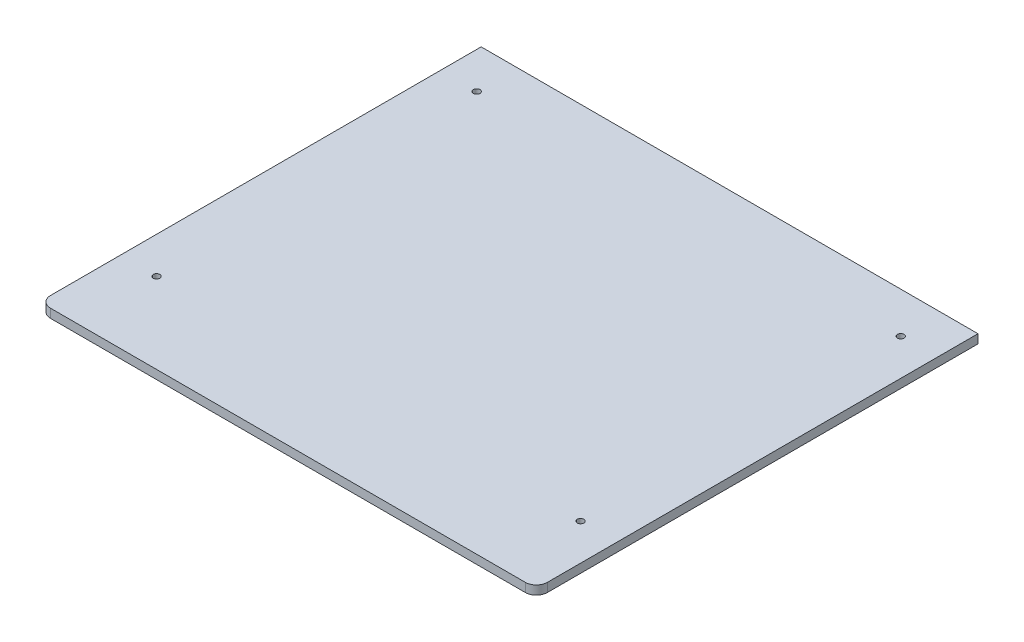
ISO-10303-21;
HEADER;
FILE_DESCRIPTION(('STEP AP214'),'2;1');
FILE_NAME('part.step','',(''),(''),'','','');
FILE_SCHEMA(('AUTOMOTIVE_DESIGN { 1 0 10303 214 1 1 1 1 }'));
ENDSEC;
DATA;
#1=APPLICATION_CONTEXT('core data for automotive mechanical design processes');
#2=APPLICATION_PROTOCOL_DEFINITION('international standard','automotive_design',2000,#1);
#3=PRODUCT_CONTEXT('',#1,'mechanical');
#4=PRODUCT('Part','Part','',(#3));
#5=PRODUCT_RELATED_PRODUCT_CATEGORY('part','',(#4));
#6=PRODUCT_DEFINITION_FORMATION('','',#4);
#7=PRODUCT_DEFINITION_CONTEXT('part definition',#1,'design');
#8=PRODUCT_DEFINITION('design','',#6,#7);
#9=PRODUCT_DEFINITION_SHAPE('','',#8);
#10=(LENGTH_UNIT() NAMED_UNIT(*) SI_UNIT(.MILLI.,.METRE.));
#11=(NAMED_UNIT(*) PLANE_ANGLE_UNIT() SI_UNIT($,.RADIAN.));
#12=(NAMED_UNIT(*) SI_UNIT($,.STERADIAN.) SOLID_ANGLE_UNIT());
#13=UNCERTAINTY_MEASURE_WITH_UNIT(LENGTH_MEASURE(1.E-05),#10,'distance_accuracy_value','');
#14=(GEOMETRIC_REPRESENTATION_CONTEXT(3) GLOBAL_UNCERTAINTY_ASSIGNED_CONTEXT((#13)) GLOBAL_UNIT_ASSIGNED_CONTEXT((#10,
#11,#12)) REPRESENTATION_CONTEXT('',''));
#15=CARTESIAN_POINT('',(0.,0.,0.));
#16=DIRECTION('',(0.,0.,1.));
#17=DIRECTION('',(1.,0.,0.));
#18=AXIS2_PLACEMENT_3D('',#15,#16,#17);
#19=CARTESIAN_POINT('',(0.,8.,0.));
#20=DIRECTION('',(1.,0.,0.));
#21=DIRECTION('',(0.,0.,-1.));
#22=AXIS2_PLACEMENT_3D('',#19,#20,#21);
#23=PLANE('',#22);
#24=DIRECTION('',(0.,0.,1.));
#25=VECTOR('',#24,1.);
#26=CARTESIAN_POINT('',(0.,0.,0.));
#27=LINE('',#26,#25);
#28=CARTESIAN_POINT('',(0.,0.,0.));
#29=VERTEX_POINT('',#28);
#30=CARTESIAN_POINT('',(0.,0.,390.));
#31=VERTEX_POINT('',#30);
#32=EDGE_CURVE('E116',#29,#31,#27,.T.);
#33=ORIENTED_EDGE('',*,*,#32,.T.);
#34=DIRECTION('',(0.,-1.,0.));
#35=VECTOR('',#34,1.);
#36=CARTESIAN_POINT('',(0.,8.,390.));
#37=LINE('',#36,#35);
#38=CARTESIAN_POINT('',(0.,8.,390.));
#39=VERTEX_POINT('',#38);
#40=EDGE_CURVE('E11',#31,#39,#37,.F.);
#41=ORIENTED_EDGE('',*,*,#40,.T.);
#42=DIRECTION('',(0.,0.,1.));
#43=VECTOR('',#42,1.);
#44=CARTESIAN_POINT('',(0.,8.,0.));
#45=LINE('',#44,#43);
#46=CARTESIAN_POINT('',(0.,8.,0.));
#47=VERTEX_POINT('',#46);
#48=EDGE_CURVE('E123',#47,#39,#45,.T.);
#49=ORIENTED_EDGE('',*,*,#48,.F.);
#50=DIRECTION('',(0.,-1.,0.));
#51=VECTOR('',#50,1.);
#52=CARTESIAN_POINT('',(0.,8.,0.));
#53=LINE('',#52,#51);
#54=EDGE_CURVE('E108',#47,#29,#53,.T.);
#55=ORIENTED_EDGE('',*,*,#54,.T.);
#56=EDGE_LOOP('',(#33,#41,#49,#55));
#57=FACE_BOUND('',#56,.T.);
#58=ADVANCED_FACE('F34',(#57),#23,.F.);
#59=CARTESIAN_POINT('',(0.,8.,400.));
#60=DIRECTION('',(0.,0.,-1.));
#61=DIRECTION('',(-1.,0.,0.));
#62=AXIS2_PLACEMENT_3D('',#59,#60,#61);
#63=PLANE('',#62);
#64=DIRECTION('',(1.,0.,0.));
#65=VECTOR('',#64,1.);
#66=CARTESIAN_POINT('',(0.,0.,400.));
#67=LINE('',#66,#65);
#68=CARTESIAN_POINT('',(10.,0.,400.));
#69=VERTEX_POINT('',#68);
#70=CARTESIAN_POINT('',(440.,0.,400.));
#71=VERTEX_POINT('',#70);
#72=EDGE_CURVE('E118',#69,#71,#67,.T.);
#73=ORIENTED_EDGE('',*,*,#72,.T.);
#74=DIRECTION('',(0.,-1.,0.));
#75=VECTOR('',#74,1.);
#76=CARTESIAN_POINT('',(440.,8.,400.));
#77=LINE('',#76,#75);
#78=CARTESIAN_POINT('',(440.,8.,400.));
#79=VERTEX_POINT('',#78);
#80=EDGE_CURVE('E55',#71,#79,#77,.F.);
#81=ORIENTED_EDGE('',*,*,#80,.T.);
#82=DIRECTION('',(1.,0.,0.));
#83=VECTOR('',#82,1.);
#84=CARTESIAN_POINT('',(0.,8.,400.));
#85=LINE('',#84,#83);
#86=CARTESIAN_POINT('',(10.,8.,400.));
#87=VERTEX_POINT('',#86);
#88=EDGE_CURVE('E98',#87,#79,#85,.T.);
#89=ORIENTED_EDGE('',*,*,#88,.F.);
#90=DIRECTION('',(0.,-1.,0.));
#91=VECTOR('',#90,1.);
#92=CARTESIAN_POINT('',(10.,8.,400.));
#93=LINE('',#92,#91);
#94=EDGE_CURVE('E130',#87,#69,#93,.T.);
#95=ORIENTED_EDGE('',*,*,#94,.T.);
#96=EDGE_LOOP('',(#73,#81,#89,#95));
#97=FACE_BOUND('',#96,.T.);
#98=ADVANCED_FACE('F138',(#97),#63,.F.);
#99=CARTESIAN_POINT('',(450.,8.,0.));
#100=DIRECTION('',(-1.,0.,0.));
#101=DIRECTION('',(0.,0.,1.));
#102=AXIS2_PLACEMENT_3D('',#99,#100,#101);
#103=PLANE('',#102);
#104=DIRECTION('',(0.,0.,-1.));
#105=VECTOR('',#104,1.);
#106=CARTESIAN_POINT('',(450.,8.,0.));
#107=LINE('',#106,#105);
#108=CARTESIAN_POINT('',(450.,8.,390.));
#109=VERTEX_POINT('',#108);
#110=CARTESIAN_POINT('',(450.,8.,0.));
#111=VERTEX_POINT('',#110);
#112=EDGE_CURVE('E88',#109,#111,#107,.T.);
#113=ORIENTED_EDGE('',*,*,#112,.F.);
#114=DIRECTION('',(0.,-1.,0.));
#115=VECTOR('',#114,1.);
#116=CARTESIAN_POINT('',(450.,8.,390.));
#117=LINE('',#116,#115);
#118=CARTESIAN_POINT('',(450.,0.,390.));
#119=VERTEX_POINT('',#118);
#120=EDGE_CURVE('E107',#109,#119,#117,.T.);
#121=ORIENTED_EDGE('',*,*,#120,.T.);
#122=DIRECTION('',(0.,0.,-1.));
#123=VECTOR('',#122,1.);
#124=CARTESIAN_POINT('',(450.,0.,0.));
#125=LINE('',#124,#123);
#126=CARTESIAN_POINT('',(450.,0.,0.));
#127=VERTEX_POINT('',#126);
#128=EDGE_CURVE('E104',#119,#127,#125,.T.);
#129=ORIENTED_EDGE('',*,*,#128,.T.);
#130=DIRECTION('',(0.,-1.,0.));
#131=VECTOR('',#130,1.);
#132=CARTESIAN_POINT('',(450.,8.,0.));
#133=LINE('',#132,#131);
#134=EDGE_CURVE('E101',#111,#127,#133,.T.);
#135=ORIENTED_EDGE('',*,*,#134,.F.);
#136=EDGE_LOOP('',(#113,#121,#129,#135));
#137=FACE_BOUND('',#136,.T.);
#138=ADVANCED_FACE('F102',(#137),#103,.F.);
#139=CARTESIAN_POINT('',(0.,8.,0.));
#140=DIRECTION('',(0.,0.,1.));
#141=DIRECTION('',(1.,0.,0.));
#142=AXIS2_PLACEMENT_3D('',#139,#140,#141);
#143=PLANE('',#142);
#144=DIRECTION('',(-1.,0.,0.));
#145=VECTOR('',#144,1.);
#146=CARTESIAN_POINT('',(0.,0.,0.));
#147=LINE('',#146,#145);
#148=EDGE_CURVE('E122',#127,#29,#147,.T.);
#149=ORIENTED_EDGE('',*,*,#148,.T.);
#150=ORIENTED_EDGE('',*,*,#54,.F.);
#151=DIRECTION('',(-1.,0.,0.));
#152=VECTOR('',#151,1.);
#153=CARTESIAN_POINT('',(0.,8.,0.));
#154=LINE('',#153,#152);
#155=EDGE_CURVE('E92',#111,#47,#154,.T.);
#156=ORIENTED_EDGE('',*,*,#155,.F.);
#157=ORIENTED_EDGE('',*,*,#134,.T.);
#158=EDGE_LOOP('',(#149,#150,#156,#157));
#159=FACE_BOUND('',#158,.T.);
#160=ADVANCED_FACE('F110',(#159),#143,.F.);
#161=CARTESIAN_POINT('',(0.,8.,400.));
#162=DIRECTION('',(0.,1.,0.));
#163=DIRECTION('',(0.,0.,1.));
#164=AXIS2_PLACEMENT_3D('',#161,#162,#163);
#165=PLANE('',#164);
#166=CARTESIAN_POINT('',(417.,8.,327.));
#167=DIRECTION('',(0.,1.,0.));
#168=DIRECTION('',(0.,0.,1.));
#169=AXIS2_PLACEMENT_3D('',#166,#167,#168);
#170=CIRCLE('',#169,2.99999999999999);
#171=CARTESIAN_POINT('',(417.,8.,330.));
#172=VERTEX_POINT('',#171);
#173=EDGE_CURVE('E163',#172,#172,#170,.T.);
#174=ORIENTED_EDGE('',*,*,#173,.F.);
#175=EDGE_LOOP('',(#174));
#176=FACE_BOUND('',#175,.T.);
#177=CARTESIAN_POINT('',(417.,8.,37.));
#178=DIRECTION('',(0.,1.,0.));
#179=DIRECTION('',(0.,0.,1.));
#180=AXIS2_PLACEMENT_3D('',#177,#178,#179);
#181=CIRCLE('',#180,2.99999999999999);
#182=CARTESIAN_POINT('',(417.,8.,40.));
#183=VERTEX_POINT('',#182);
#184=EDGE_CURVE('E157',#183,#183,#181,.T.);
#185=ORIENTED_EDGE('',*,*,#184,.F.);
#186=EDGE_LOOP('',(#185));
#187=FACE_BOUND('',#186,.T.);
#188=CARTESIAN_POINT('',(33.,8.,327.));
#189=DIRECTION('',(0.,1.,0.));
#190=DIRECTION('',(0.,0.,1.));
#191=AXIS2_PLACEMENT_3D('',#188,#189,#190);
#192=CIRCLE('',#191,3.);
#193=CARTESIAN_POINT('',(33.,8.,330.));
#194=VERTEX_POINT('',#193);
#195=EDGE_CURVE('E151',#194,#194,#192,.T.);
#196=ORIENTED_EDGE('',*,*,#195,.F.);
#197=EDGE_LOOP('',(#196));
#198=FACE_BOUND('',#197,.T.);
#199=CARTESIAN_POINT('',(33.,8.,37.));
#200=DIRECTION('',(0.,1.,0.));
#201=DIRECTION('',(0.,0.,1.));
#202=AXIS2_PLACEMENT_3D('',#199,#200,#201);
#203=CIRCLE('',#202,3.);
#204=CARTESIAN_POINT('',(33.,8.,40.));
#205=VERTEX_POINT('',#204);
#206=EDGE_CURVE('E145',#205,#205,#203,.T.);
#207=ORIENTED_EDGE('',*,*,#206,.F.);
#208=EDGE_LOOP('',(#207));
#209=FACE_BOUND('',#208,.T.);
#210=ORIENTED_EDGE('',*,*,#88,.T.);
#211=CARTESIAN_POINT('',(440.,8.,390.));
#212=DIRECTION('',(0.,1.,0.));
#213=DIRECTION('',(0.,0.,1.));
#214=AXIS2_PLACEMENT_3D('',#211,#212,#213);
#215=CIRCLE('',#214,10.);
#216=EDGE_CURVE('E42',#79,#109,#215,.T.);
#217=ORIENTED_EDGE('',*,*,#216,.T.);
#218=ORIENTED_EDGE('',*,*,#112,.T.);
#219=ORIENTED_EDGE('',*,*,#155,.T.);
#220=ORIENTED_EDGE('',*,*,#48,.T.);
#221=CARTESIAN_POINT('',(10.,8.,390.));
#222=DIRECTION('',(0.,1.,0.));
#223=DIRECTION('',(0.,0.,1.));
#224=AXIS2_PLACEMENT_3D('',#221,#222,#223);
#225=CIRCLE('',#224,10.);
#226=EDGE_CURVE('E134',#39,#87,#225,.T.);
#227=ORIENTED_EDGE('',*,*,#226,.T.);
#228=EDGE_LOOP('',(#210,#217,#218,#219,#220,#227));
#229=FACE_BOUND('',#228,.T.);
#230=ADVANCED_FACE('F90',(#176,#187,#198,#209,#229),#165,.T.);
#231=CARTESIAN_POINT('',(0.,0.,400.));
#232=DIRECTION('',(0.,1.,0.));
#233=DIRECTION('',(0.,0.,1.));
#234=AXIS2_PLACEMENT_3D('',#231,#232,#233);
#235=PLANE('',#234);
#236=CARTESIAN_POINT('',(417.,0.,327.));
#237=DIRECTION('',(0.,1.,0.));
#238=DIRECTION('',(0.,0.,1.));
#239=AXIS2_PLACEMENT_3D('',#236,#237,#238);
#240=CIRCLE('',#239,2.99999999999999);
#241=CARTESIAN_POINT('',(417.,0.,330.));
#242=VERTEX_POINT('',#241);
#243=EDGE_CURVE('E160',#242,#242,#240,.T.);
#244=ORIENTED_EDGE('',*,*,#243,.T.);
#245=EDGE_LOOP('',(#244));
#246=FACE_BOUND('',#245,.T.);
#247=CARTESIAN_POINT('',(417.,0.,37.));
#248=DIRECTION('',(0.,1.,0.));
#249=DIRECTION('',(0.,0.,1.));
#250=AXIS2_PLACEMENT_3D('',#247,#248,#249);
#251=CIRCLE('',#250,2.99999999999999);
#252=CARTESIAN_POINT('',(417.,0.,40.));
#253=VERTEX_POINT('',#252);
#254=EDGE_CURVE('E154',#253,#253,#251,.T.);
#255=ORIENTED_EDGE('',*,*,#254,.T.);
#256=EDGE_LOOP('',(#255));
#257=FACE_BOUND('',#256,.T.);
#258=CARTESIAN_POINT('',(33.,0.,327.));
#259=DIRECTION('',(0.,1.,0.));
#260=DIRECTION('',(0.,0.,1.));
#261=AXIS2_PLACEMENT_3D('',#258,#259,#260);
#262=CIRCLE('',#261,3.);
#263=CARTESIAN_POINT('',(33.,0.,330.));
#264=VERTEX_POINT('',#263);
#265=EDGE_CURVE('E148',#264,#264,#262,.T.);
#266=ORIENTED_EDGE('',*,*,#265,.T.);
#267=EDGE_LOOP('',(#266));
#268=FACE_BOUND('',#267,.T.);
#269=CARTESIAN_POINT('',(33.,0.,37.));
#270=DIRECTION('',(0.,1.,0.));
#271=DIRECTION('',(0.,0.,1.));
#272=AXIS2_PLACEMENT_3D('',#269,#270,#271);
#273=CIRCLE('',#272,3.);
#274=CARTESIAN_POINT('',(33.,0.,40.));
#275=VERTEX_POINT('',#274);
#276=EDGE_CURVE('E119',#275,#275,#273,.T.);
#277=ORIENTED_EDGE('',*,*,#276,.T.);
#278=EDGE_LOOP('',(#277));
#279=FACE_BOUND('',#278,.T.);
#280=ORIENTED_EDGE('',*,*,#128,.F.);
#281=CARTESIAN_POINT('',(440.,0.,390.));
#282=DIRECTION('',(0.,1.,0.));
#283=DIRECTION('',(0.,0.,1.));
#284=AXIS2_PLACEMENT_3D('',#281,#282,#283);
#285=CIRCLE('',#284,10.);
#286=EDGE_CURVE('E128',#119,#71,#285,.F.);
#287=ORIENTED_EDGE('',*,*,#286,.T.);
#288=ORIENTED_EDGE('',*,*,#72,.F.);
#289=CARTESIAN_POINT('',(10.,0.,390.));
#290=DIRECTION('',(0.,1.,0.));
#291=DIRECTION('',(0.,0.,1.));
#292=AXIS2_PLACEMENT_3D('',#289,#290,#291);
#293=CIRCLE('',#292,10.);
#294=EDGE_CURVE('E126',#69,#31,#293,.F.);
#295=ORIENTED_EDGE('',*,*,#294,.T.);
#296=ORIENTED_EDGE('',*,*,#32,.F.);
#297=ORIENTED_EDGE('',*,*,#148,.F.);
#298=EDGE_LOOP('',(#280,#287,#288,#295,#296,#297));
#299=FACE_BOUND('',#298,.T.);
#300=ADVANCED_FACE('F142',(#246,#257,#268,#279,#299),#235,.F.);
#301=CARTESIAN_POINT('',(33.,0.,37.));
#302=DIRECTION('',(0.,1.,0.));
#303=DIRECTION('',(0.,0.,1.));
#304=AXIS2_PLACEMENT_3D('',#301,#302,#303);
#305=CYLINDRICAL_SURFACE('',#304,3.);
#306=ORIENTED_EDGE('',*,*,#276,.F.);
#307=EDGE_LOOP('',(#306));
#308=FACE_BOUND('',#307,.T.);
#309=ORIENTED_EDGE('',*,*,#206,.T.);
#310=EDGE_LOOP('',(#309));
#311=FACE_BOUND('',#310,.T.);
#312=ADVANCED_FACE('F188',(#308,#311),#305,.F.);
#313=CARTESIAN_POINT('',(33.,0.,327.));
#314=DIRECTION('',(0.,1.,0.));
#315=DIRECTION('',(0.,0.,1.));
#316=AXIS2_PLACEMENT_3D('',#313,#314,#315);
#317=CYLINDRICAL_SURFACE('',#316,3.);
#318=ORIENTED_EDGE('',*,*,#265,.F.);
#319=EDGE_LOOP('',(#318));
#320=FACE_BOUND('',#319,.T.);
#321=ORIENTED_EDGE('',*,*,#195,.T.);
#322=EDGE_LOOP('',(#321));
#323=FACE_BOUND('',#322,.T.);
#324=ADVANCED_FACE('F190',(#320,#323),#317,.F.);
#325=CARTESIAN_POINT('',(417.,0.,37.));
#326=DIRECTION('',(0.,1.,0.));
#327=DIRECTION('',(0.,0.,1.));
#328=AXIS2_PLACEMENT_3D('',#325,#326,#327);
#329=CYLINDRICAL_SURFACE('',#328,2.99999999999999);
#330=ORIENTED_EDGE('',*,*,#254,.F.);
#331=EDGE_LOOP('',(#330));
#332=FACE_BOUND('',#331,.T.);
#333=ORIENTED_EDGE('',*,*,#184,.T.);
#334=EDGE_LOOP('',(#333));
#335=FACE_BOUND('',#334,.T.);
#336=ADVANCED_FACE('F175',(#332,#335),#329,.F.);
#337=CARTESIAN_POINT('',(417.,0.,327.));
#338=DIRECTION('',(0.,1.,0.));
#339=DIRECTION('',(0.,0.,1.));
#340=AXIS2_PLACEMENT_3D('',#337,#338,#339);
#341=CYLINDRICAL_SURFACE('',#340,2.99999999999999);
#342=ORIENTED_EDGE('',*,*,#243,.F.);
#343=EDGE_LOOP('',(#342));
#344=FACE_BOUND('',#343,.T.);
#345=ORIENTED_EDGE('',*,*,#173,.T.);
#346=EDGE_LOOP('',(#345));
#347=FACE_BOUND('',#346,.T.);
#348=ADVANCED_FACE('F171',(#344,#347),#341,.F.);
#349=CARTESIAN_POINT('',(440.,8.,390.));
#350=DIRECTION('',(0.,-1.,0.));
#351=DIRECTION('',(0.,0.,-1.));
#352=AXIS2_PLACEMENT_3D('',#349,#350,#351);
#353=CYLINDRICAL_SURFACE('',#352,10.);
#354=ORIENTED_EDGE('',*,*,#216,.F.);
#355=ORIENTED_EDGE('',*,*,#80,.F.);
#356=ORIENTED_EDGE('',*,*,#286,.F.);
#357=ORIENTED_EDGE('',*,*,#120,.F.);
#358=EDGE_LOOP('',(#354,#355,#356,#357));
#359=FACE_BOUND('',#358,.T.);
#360=ADVANCED_FACE('F174',(#359),#353,.T.);
#361=CARTESIAN_POINT('',(10.,8.,390.));
#362=DIRECTION('',(0.,-1.,0.));
#363=DIRECTION('',(0.,0.,-1.));
#364=AXIS2_PLACEMENT_3D('',#361,#362,#363);
#365=CYLINDRICAL_SURFACE('',#364,10.);
#366=ORIENTED_EDGE('',*,*,#226,.F.);
#367=ORIENTED_EDGE('',*,*,#40,.F.);
#368=ORIENTED_EDGE('',*,*,#294,.F.);
#369=ORIENTED_EDGE('',*,*,#94,.F.);
#370=EDGE_LOOP('',(#366,#367,#368,#369));
#371=FACE_BOUND('',#370,.T.);
#372=ADVANCED_FACE('F36',(#371),#365,.T.);
#373=CLOSED_SHELL('',(#58,#98,#138,#160,#230,#300,#312,#324,#336,#348,#360,#372));
#374=MANIFOLD_SOLID_BREP('B2',#373);
#375=ADVANCED_BREP_SHAPE_REPRESENTATION('',(#18,#374),#14);
#376=SHAPE_DEFINITION_REPRESENTATION(#9,#375);
ENDSEC;
END-ISO-10303-21;
